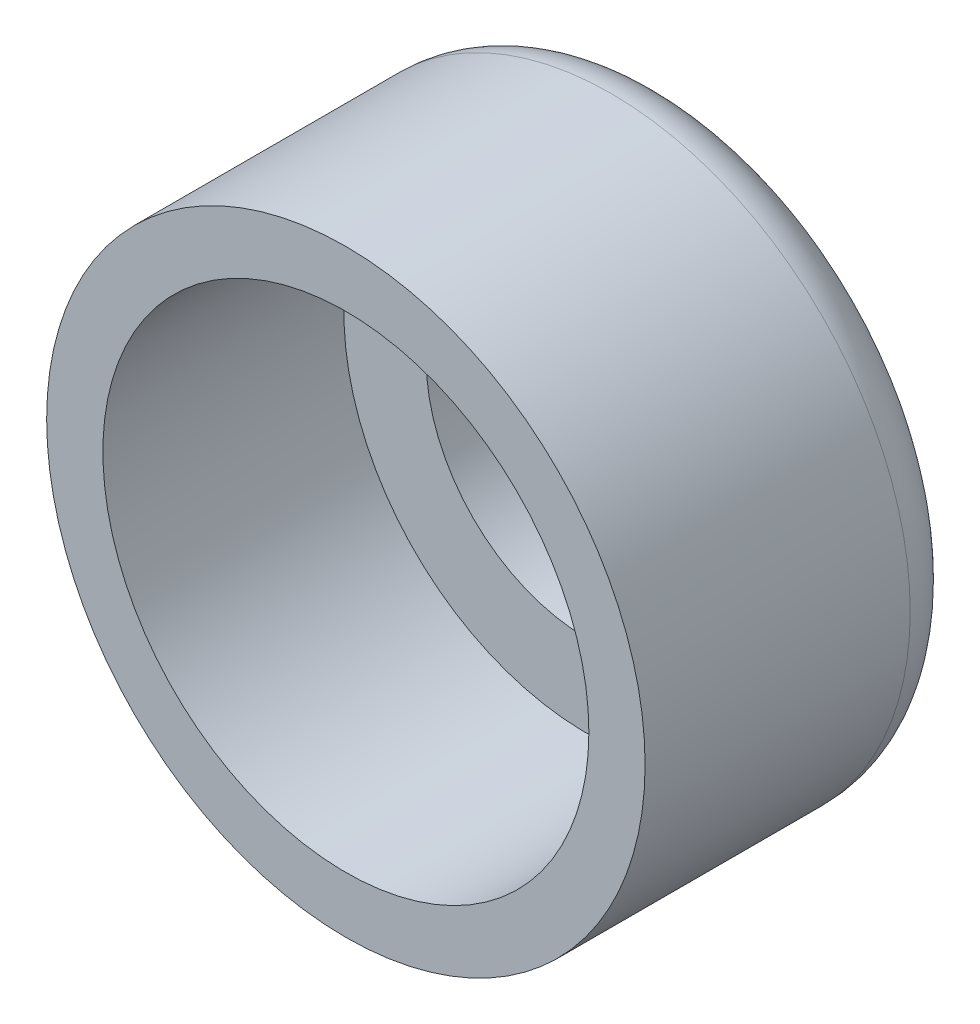
ISO-10303-21;
HEADER;
FILE_DESCRIPTION(('STEP AP214'),'2;1');
FILE_NAME('part.step','',(''),(''),'','','');
FILE_SCHEMA(('AUTOMOTIVE_DESIGN { 1 0 10303 214 1 1 1 1 }'));
ENDSEC;
DATA;
#1=APPLICATION_CONTEXT('core data for automotive mechanical design processes');
#2=APPLICATION_PROTOCOL_DEFINITION('international standard','automotive_design',2000,#1);
#3=PRODUCT_CONTEXT('',#1,'mechanical');
#4=PRODUCT('Part','Part','',(#3));
#5=PRODUCT_RELATED_PRODUCT_CATEGORY('part','',(#4));
#6=PRODUCT_DEFINITION_FORMATION('','',#4);
#7=PRODUCT_DEFINITION_CONTEXT('part definition',#1,'design');
#8=PRODUCT_DEFINITION('design','',#6,#7);
#9=PRODUCT_DEFINITION_SHAPE('','',#8);
#10=(LENGTH_UNIT() NAMED_UNIT(*) SI_UNIT(.MILLI.,.METRE.));
#11=(NAMED_UNIT(*) PLANE_ANGLE_UNIT() SI_UNIT($,.RADIAN.));
#12=(NAMED_UNIT(*) SI_UNIT($,.STERADIAN.) SOLID_ANGLE_UNIT());
#13=UNCERTAINTY_MEASURE_WITH_UNIT(LENGTH_MEASURE(1.E-05),#10,'distance_accuracy_value','');
#14=(GEOMETRIC_REPRESENTATION_CONTEXT(3) GLOBAL_UNCERTAINTY_ASSIGNED_CONTEXT((#13)) GLOBAL_UNIT_ASSIGNED_CONTEXT((#10,
#11,#12)) REPRESENTATION_CONTEXT('',''));
#15=CARTESIAN_POINT('',(0.,0.,0.));
#16=DIRECTION('',(0.,0.,1.));
#17=DIRECTION('',(1.,0.,0.));
#18=AXIS2_PLACEMENT_3D('',#15,#16,#17);
#19=CARTESIAN_POINT('',(0.,0.,1.));
#20=DIRECTION('',(0.,0.,1.));
#21=DIRECTION('',(1.,0.,0.));
#22=AXIS2_PLACEMENT_3D('',#19,#20,#21);
#23=PLANE('',#22);
#24=CARTESIAN_POINT('',(0.,0.,1.));
#25=DIRECTION('',(0.,0.,1.));
#26=DIRECTION('',(1.,0.,0.));
#27=AXIS2_PLACEMENT_3D('',#24,#25,#26);
#28=CIRCLE('',#27,2.);
#29=CARTESIAN_POINT('',(2.,0.,1.));
#30=VERTEX_POINT('',#29);
#31=EDGE_CURVE('E62',#30,#30,#28,.T.);
#32=ORIENTED_EDGE('',*,*,#31,.F.);
#33=EDGE_LOOP('',(#32));
#34=FACE_BOUND('',#33,.T.);
#35=CARTESIAN_POINT('',(0.,0.,1.));
#36=DIRECTION('',(0.,0.,1.));
#37=DIRECTION('',(1.,0.,0.));
#38=AXIS2_PLACEMENT_3D('',#35,#36,#37);
#39=CIRCLE('',#38,3.025);
#40=CARTESIAN_POINT('',(3.025,0.,1.));
#41=VERTEX_POINT('',#40);
#42=EDGE_CURVE('E57',#41,#41,#39,.F.);
#43=ORIENTED_EDGE('',*,*,#42,.F.);
#44=EDGE_LOOP('',(#43));
#45=FACE_BOUND('',#44,.T.);
#46=ADVANCED_FACE('F43',(#34,#45),#23,.T.);
#47=CARTESIAN_POINT('',(0.,0.,0.));
#48=DIRECTION('',(0.,0.,1.));
#49=DIRECTION('',(1.,0.,0.));
#50=AXIS2_PLACEMENT_3D('',#47,#48,#49);
#51=PLANE('',#50);
#52=CARTESIAN_POINT('',(0.,0.,0.));
#53=DIRECTION('',(0.,0.,1.));
#54=DIRECTION('',(1.,0.,0.));
#55=AXIS2_PLACEMENT_3D('',#52,#53,#54);
#56=CIRCLE('',#55,3.025);
#57=CARTESIAN_POINT('',(3.025,0.,0.));
#58=VERTEX_POINT('',#57);
#59=EDGE_CURVE('E10',#58,#58,#56,.F.);
#60=ORIENTED_EDGE('',*,*,#59,.T.);
#61=EDGE_LOOP('',(#60));
#62=FACE_BOUND('',#61,.T.);
#63=CARTESIAN_POINT('',(0.,0.,0.));
#64=DIRECTION('',(0.,0.,1.));
#65=DIRECTION('',(1.,0.,0.));
#66=AXIS2_PLACEMENT_3D('',#63,#64,#65);
#67=CIRCLE('',#66,2.);
#68=CARTESIAN_POINT('',(2.,0.,0.));
#69=VERTEX_POINT('',#68);
#70=EDGE_CURVE('E61',#69,#69,#67,.T.);
#71=ORIENTED_EDGE('',*,*,#70,.T.);
#72=EDGE_LOOP('',(#71));
#73=FACE_BOUND('',#72,.T.);
#74=ADVANCED_FACE('F97',(#62,#73),#51,.F.);
#75=CARTESIAN_POINT('',(0.,0.,1.));
#76=DIRECTION('',(0.,0.,-1.));
#77=DIRECTION('',(-1.,0.,0.));
#78=AXIS2_PLACEMENT_3D('',#75,#76,#77);
#79=CYLINDRICAL_SURFACE('',#78,3.725);
#80=CARTESIAN_POINT('',(0.,0.,0.7));
#81=DIRECTION('',(0.,0.,1.));
#82=DIRECTION('',(1.,0.,0.));
#83=AXIS2_PLACEMENT_3D('',#80,#81,#82);
#84=CIRCLE('',#83,3.725);
#85=CARTESIAN_POINT('',(3.725,0.,0.7));
#86=VERTEX_POINT('',#85);
#87=EDGE_CURVE('E51',#86,#86,#84,.T.);
#88=ORIENTED_EDGE('',*,*,#87,.T.);
#89=EDGE_LOOP('',(#88));
#90=FACE_BOUND('',#89,.T.);
#91=CARTESIAN_POINT('',(0.,0.,4.));
#92=DIRECTION('',(0.,0.,1.));
#93=DIRECTION('',(1.,0.,0.));
#94=AXIS2_PLACEMENT_3D('',#91,#92,#93);
#95=CIRCLE('',#94,3.725);
#96=CARTESIAN_POINT('',(3.725,0.,4.));
#97=VERTEX_POINT('',#96);
#98=EDGE_CURVE('E67',#97,#97,#95,.T.);
#99=ORIENTED_EDGE('',*,*,#98,.F.);
#100=EDGE_LOOP('',(#99));
#101=FACE_BOUND('',#100,.T.);
#102=ADVANCED_FACE('F94',(#90,#101),#79,.T.);
#103=CARTESIAN_POINT('',(0.,0.,1.));
#104=DIRECTION('',(0.,0.,-1.));
#105=DIRECTION('',(-1.,0.,0.));
#106=AXIS2_PLACEMENT_3D('',#103,#104,#105);
#107=CYLINDRICAL_SURFACE('',#106,2.);
#108=ORIENTED_EDGE('',*,*,#31,.T.);
#109=EDGE_LOOP('',(#108));
#110=FACE_BOUND('',#109,.T.);
#111=ORIENTED_EDGE('',*,*,#70,.F.);
#112=EDGE_LOOP('',(#111));
#113=FACE_BOUND('',#112,.T.);
#114=ADVANCED_FACE('F83',(#110,#113),#107,.F.);
#115=CARTESIAN_POINT('',(0.,0.,4.));
#116=DIRECTION('',(0.,0.,1.));
#117=DIRECTION('',(1.,0.,0.));
#118=AXIS2_PLACEMENT_3D('',#115,#116,#117);
#119=PLANE('',#118);
#120=ORIENTED_EDGE('',*,*,#98,.T.);
#121=EDGE_LOOP('',(#120));
#122=FACE_BOUND('',#121,.T.);
#123=CARTESIAN_POINT('',(0.,0.,4.));
#124=DIRECTION('',(0.,0.,1.));
#125=DIRECTION('',(1.,0.,0.));
#126=AXIS2_PLACEMENT_3D('',#123,#124,#125);
#127=CIRCLE('',#126,3.025);
#128=CARTESIAN_POINT('',(3.025,0.,4.));
#129=VERTEX_POINT('',#128);
#130=EDGE_CURVE('E71',#129,#129,#127,.T.);
#131=ORIENTED_EDGE('',*,*,#130,.F.);
#132=EDGE_LOOP('',(#131));
#133=FACE_BOUND('',#132,.T.);
#134=ADVANCED_FACE('F84',(#122,#133),#119,.T.);
#135=CARTESIAN_POINT('',(0.,0.,4.));
#136=DIRECTION('',(0.,0.,-1.));
#137=DIRECTION('',(-1.,0.,0.));
#138=AXIS2_PLACEMENT_3D('',#135,#136,#137);
#139=CYLINDRICAL_SURFACE('',#138,3.025);
#140=ORIENTED_EDGE('',*,*,#130,.T.);
#141=EDGE_LOOP('',(#140));
#142=FACE_BOUND('',#141,.T.);
#143=ORIENTED_EDGE('',*,*,#42,.T.);
#144=EDGE_LOOP('',(#143));
#145=FACE_BOUND('',#144,.T.);
#146=ADVANCED_FACE('F78',(#142,#145),#139,.F.);
#147=CARTESIAN_POINT('',(0.,0.,0.7));
#148=DIRECTION('',(0.,0.,1.));
#149=DIRECTION('',(1.,0.,0.));
#150=AXIS2_PLACEMENT_3D('',#147,#148,#149);
#151=TOROIDAL_SURFACE('',#150,3.025,0.7);
#152=ORIENTED_EDGE('',*,*,#59,.F.);
#153=EDGE_LOOP('',(#152));
#154=FACE_BOUND('',#153,.T.);
#155=ORIENTED_EDGE('',*,*,#87,.F.);
#156=EDGE_LOOP('',(#155));
#157=FACE_BOUND('',#156,.T.);
#158=ADVANCED_FACE('F44',(#154,#157),#151,.T.);
#159=CLOSED_SHELL('',(#46,#74,#102,#114,#134,#146,#158));
#160=MANIFOLD_SOLID_BREP('B2',#159);
#161=ADVANCED_BREP_SHAPE_REPRESENTATION('',(#18,#160),#14);
#162=SHAPE_DEFINITION_REPRESENTATION(#9,#161);
ENDSEC;
END-ISO-10303-21;
